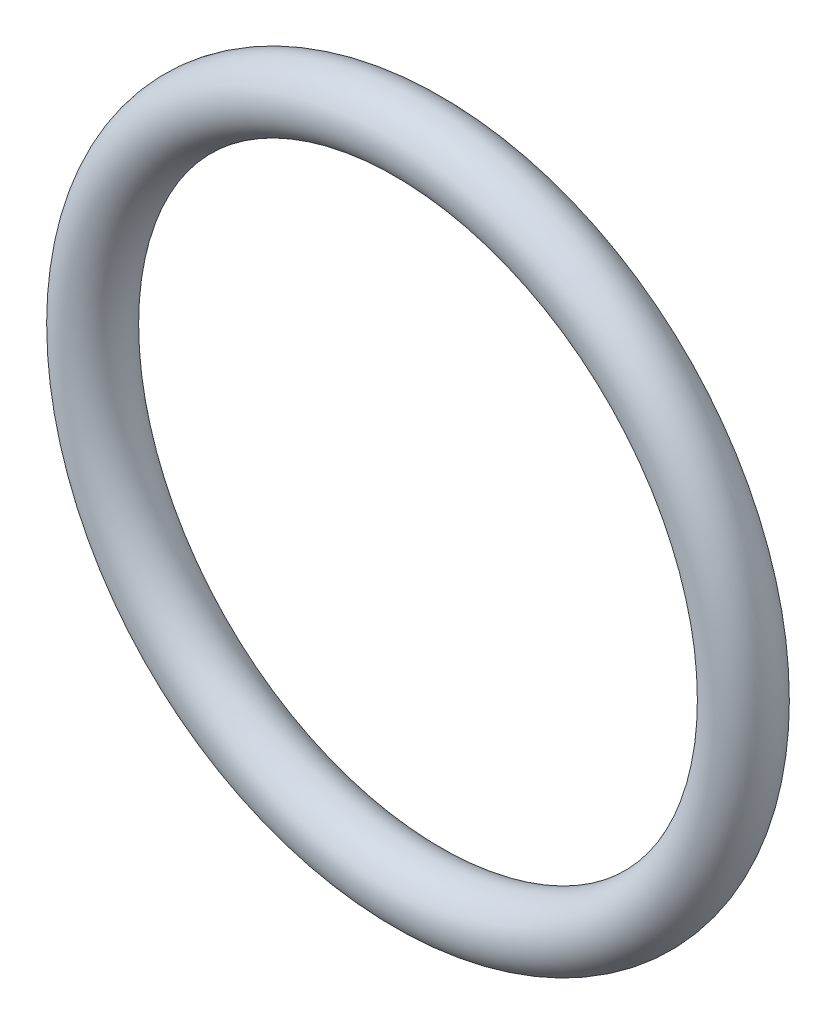
ISO-10303-21;
HEADER;
FILE_DESCRIPTION(('STEP AP214'),'2;1');
FILE_NAME('part.step','',(''),(''),'','','');
FILE_SCHEMA(('AUTOMOTIVE_DESIGN { 1 0 10303 214 1 1 1 1 }'));
ENDSEC;
DATA;
#1=APPLICATION_CONTEXT('core data for automotive mechanical design processes');
#2=APPLICATION_PROTOCOL_DEFINITION('international standard','automotive_design',2000,#1);
#3=PRODUCT_CONTEXT('',#1,'mechanical');
#4=PRODUCT('Part','Part','',(#3));
#5=PRODUCT_RELATED_PRODUCT_CATEGORY('part','',(#4));
#6=PRODUCT_DEFINITION_FORMATION('','',#4);
#7=PRODUCT_DEFINITION_CONTEXT('part definition',#1,'design');
#8=PRODUCT_DEFINITION('design','',#6,#7);
#9=PRODUCT_DEFINITION_SHAPE('','',#8);
#10=(LENGTH_UNIT() NAMED_UNIT(*) SI_UNIT(.MILLI.,.METRE.));
#11=(NAMED_UNIT(*) PLANE_ANGLE_UNIT() SI_UNIT($,.RADIAN.));
#12=(NAMED_UNIT(*) SI_UNIT($,.STERADIAN.) SOLID_ANGLE_UNIT());
#13=UNCERTAINTY_MEASURE_WITH_UNIT(LENGTH_MEASURE(1.E-05),#10,'distance_accuracy_value','');
#14=(GEOMETRIC_REPRESENTATION_CONTEXT(3) GLOBAL_UNCERTAINTY_ASSIGNED_CONTEXT((#13)) GLOBAL_UNIT_ASSIGNED_CONTEXT((#10,
#11,#12)) REPRESENTATION_CONTEXT('',''));
#15=CARTESIAN_POINT('',(0.,0.,0.));
#16=DIRECTION('',(0.,0.,1.));
#17=DIRECTION('',(1.,0.,0.));
#18=AXIS2_PLACEMENT_3D('',#15,#16,#17);
#19=CARTESIAN_POINT('',(0.,0.,0.));
#20=DIRECTION('',(0.,0.,-1.));
#21=DIRECTION('',(-1.,0.,0.));
#22=AXIS2_PLACEMENT_3D('',#19,#20,#21);
#23=TOROIDAL_SURFACE('',#22,5.,0.500000000000001);
#24=CARTESIAN_POINT('',(-5.5,0.,0.));
#25=VERTEX_POINT('',#24);
#26=VERTEX_LOOP('',#25);
#27=FACE_BOUND('',#26,.T.);
#28=ADVANCED_FACE('F28',(#27),#23,.T.);
#29=CLOSED_SHELL('',(#28));
#30=MANIFOLD_SOLID_BREP('B2',#29);
#31=ADVANCED_BREP_SHAPE_REPRESENTATION('',(#18,#30),#14);
#32=SHAPE_DEFINITION_REPRESENTATION(#9,#31);
ENDSEC;
END-ISO-10303-21;
